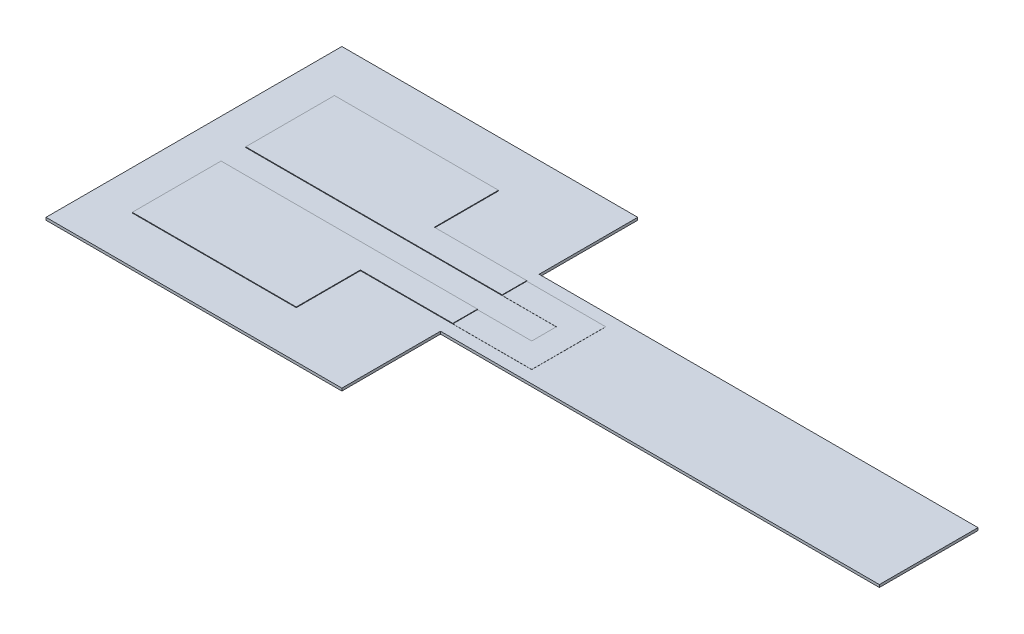
ISO-10303-21;
HEADER;
FILE_DESCRIPTION(('STEP AP214'),'2;1');
FILE_NAME('part.step','',(''),(''),'','','');
FILE_SCHEMA(('AUTOMOTIVE_DESIGN { 1 0 10303 214 1 1 1 1 }'));
ENDSEC;
DATA;
#1=APPLICATION_CONTEXT('core data for automotive mechanical design processes');
#2=APPLICATION_PROTOCOL_DEFINITION('international standard','automotive_design',2000,#1);
#3=PRODUCT_CONTEXT('',#1,'mechanical');
#4=PRODUCT('Part','Part','',(#3));
#5=PRODUCT_RELATED_PRODUCT_CATEGORY('part','',(#4));
#6=PRODUCT_DEFINITION_FORMATION('','',#4);
#7=PRODUCT_DEFINITION_CONTEXT('part definition',#1,'design');
#8=PRODUCT_DEFINITION('design','',#6,#7);
#9=PRODUCT_DEFINITION_SHAPE('','',#8);
#10=(LENGTH_UNIT() NAMED_UNIT(*) SI_UNIT(.MILLI.,.METRE.));
#11=(NAMED_UNIT(*) PLANE_ANGLE_UNIT() SI_UNIT($,.RADIAN.));
#12=(NAMED_UNIT(*) SI_UNIT($,.STERADIAN.) SOLID_ANGLE_UNIT());
#13=UNCERTAINTY_MEASURE_WITH_UNIT(LENGTH_MEASURE(1.E-05),#10,'distance_accuracy_value','');
#14=(GEOMETRIC_REPRESENTATION_CONTEXT(3) GLOBAL_UNCERTAINTY_ASSIGNED_CONTEXT((#13)) GLOBAL_UNIT_ASSIGNED_CONTEXT((#10,
#11,#12)) REPRESENTATION_CONTEXT('',''));
#15=CARTESIAN_POINT('',(0.,0.,0.));
#16=DIRECTION('',(0.,0.,1.));
#17=DIRECTION('',(1.,0.,0.));
#18=AXIS2_PLACEMENT_3D('',#15,#16,#17);
#19=CARTESIAN_POINT('',(0.,0.0001,0.));
#20=DIRECTION('',(0.,1.,0.));
#21=DIRECTION('',(0.,0.,1.));
#22=AXIS2_PLACEMENT_3D('',#19,#20,#21);
#23=PLANE('',#22);
#24=DIRECTION('',(0.,0.,1.));
#25=VECTOR('',#24,1.);
#26=CARTESIAN_POINT('',(0.,0.0001,-15.));
#27=LINE('',#26,#25);
#28=CARTESIAN_POINT('',(0.,0.0001,-15.));
#29=VERTEX_POINT('',#28);
#30=CARTESIAN_POINT('',(0.,0.0001,15.));
#31=VERTEX_POINT('',#30);
#32=EDGE_CURVE('E329',#29,#31,#27,.T.);
#33=ORIENTED_EDGE('',*,*,#32,.T.);
#34=DIRECTION('',(1.,0.,0.));
#35=VECTOR('',#34,1.);
#36=CARTESIAN_POINT('',(0.,0.0001,15.));
#37=LINE('',#36,#35);
#38=CARTESIAN_POINT('',(30.,0.0001,15.));
#39=VERTEX_POINT('',#38);
#40=EDGE_CURVE('E332',#31,#39,#37,.T.);
#41=ORIENTED_EDGE('',*,*,#40,.T.);
#42=DIRECTION('',(0.,0.,-1.));
#43=VECTOR('',#42,1.);
#44=CARTESIAN_POINT('',(30.,0.0001,15.));
#45=LINE('',#44,#43);
#46=CARTESIAN_POINT('',(30.,0.0001,5.));
#47=VERTEX_POINT('',#46);
#48=EDGE_CURVE('E334',#39,#47,#45,.T.);
#49=ORIENTED_EDGE('',*,*,#48,.T.);
#50=DIRECTION('',(1.,0.,0.));
#51=VECTOR('',#50,1.);
#52=CARTESIAN_POINT('',(30.,0.0001,5.));
#53=LINE('',#52,#51);
#54=CARTESIAN_POINT('',(74.5,0.0001,5.));
#55=VERTEX_POINT('',#54);
#56=EDGE_CURVE('E336',#47,#55,#53,.T.);
#57=ORIENTED_EDGE('',*,*,#56,.T.);
#58=DIRECTION('',(0.,0.,-1.));
#59=VECTOR('',#58,1.);
#60=CARTESIAN_POINT('',(74.5,0.0001,-5.));
#61=LINE('',#60,#59);
#62=CARTESIAN_POINT('',(74.5,0.0001,-5.));
#63=VERTEX_POINT('',#62);
#64=EDGE_CURVE('E338',#55,#63,#61,.T.);
#65=ORIENTED_EDGE('',*,*,#64,.T.);
#66=DIRECTION('',(-1.,0.,0.));
#67=VECTOR('',#66,1.);
#68=CARTESIAN_POINT('',(30.,0.0001,-5.));
#69=LINE('',#68,#67);
#70=CARTESIAN_POINT('',(30.,0.0001,-5.));
#71=VERTEX_POINT('',#70);
#72=EDGE_CURVE('E340',#63,#71,#69,.T.);
#73=ORIENTED_EDGE('',*,*,#72,.T.);
#74=DIRECTION('',(0.,0.,-1.));
#75=VECTOR('',#74,1.);
#76=CARTESIAN_POINT('',(30.,0.0001,-15.));
#77=LINE('',#76,#75);
#78=CARTESIAN_POINT('',(30.,0.0001,-15.));
#79=VERTEX_POINT('',#78);
#80=EDGE_CURVE('E342',#71,#79,#77,.T.);
#81=ORIENTED_EDGE('',*,*,#80,.T.);
#82=DIRECTION('',(-1.,0.,0.));
#83=VECTOR('',#82,1.);
#84=CARTESIAN_POINT('',(0.,0.0001,-15.));
#85=LINE('',#84,#83);
#86=EDGE_CURVE('E344',#79,#29,#85,.T.);
#87=ORIENTED_EDGE('',*,*,#86,.T.);
#88=EDGE_LOOP('',(#33,#41,#49,#57,#65,#73,#81,#87));
#89=FACE_BOUND('',#88,.T.);
#90=DIRECTION('',(0.,0.,1.));
#91=VECTOR('',#90,1.);
#92=CARTESIAN_POINT('',(4.,0.0001,10.25));
#93=LINE('',#92,#91);
#94=CARTESIAN_POINT('',(4.,0.0001,1.25000000000001));
#95=VERTEX_POINT('',#94);
#96=CARTESIAN_POINT('',(4.,0.0001,10.25));
#97=VERTEX_POINT('',#96);
#98=EDGE_CURVE('E401',#95,#97,#93,.T.);
#99=ORIENTED_EDGE('',*,*,#98,.F.);
#100=DIRECTION('',(-1.,0.,0.));
#101=VECTOR('',#100,1.);
#102=CARTESIAN_POINT('',(35.5,0.0001,1.25));
#103=LINE('',#102,#101);
#104=CARTESIAN_POINT('',(35.5,0.0001,1.25));
#105=VERTEX_POINT('',#104);
#106=EDGE_CURVE('E60',#105,#95,#103,.T.);
#107=ORIENTED_EDGE('',*,*,#106,.F.);
#108=DIRECTION('',(0.,0.,1.));
#109=VECTOR('',#108,1.);
#110=CARTESIAN_POINT('',(35.5,0.0001,-1.24999999999999));
#111=LINE('',#110,#109);
#112=CARTESIAN_POINT('',(35.5,0.0001,-1.24999999999999));
#113=VERTEX_POINT('',#112);
#114=EDGE_CURVE('E290',#113,#105,#111,.T.);
#115=ORIENTED_EDGE('',*,*,#114,.F.);
#116=DIRECTION('',(1.,0.,0.));
#117=VECTOR('',#116,1.);
#118=CARTESIAN_POINT('',(30.,0.0001,-1.24999999999999));
#119=LINE('',#118,#117);
#120=CARTESIAN_POINT('',(4.,0.0001,-1.24999999999999));
#121=VERTEX_POINT('',#120);
#122=EDGE_CURVE('E287',#121,#113,#119,.T.);
#123=ORIENTED_EDGE('',*,*,#122,.F.);
#124=DIRECTION('',(0.,0.,1.));
#125=VECTOR('',#124,1.);
#126=CARTESIAN_POINT('',(4.,0.0001,-10.25));
#127=LINE('',#126,#125);
#128=CARTESIAN_POINT('',(4.,0.0001,-10.25));
#129=VERTEX_POINT('',#128);
#130=EDGE_CURVE('E234',#129,#121,#127,.T.);
#131=ORIENTED_EDGE('',*,*,#130,.F.);
#132=DIRECTION('',(-1.,0.,0.));
#133=VECTOR('',#132,1.);
#134=CARTESIAN_POINT('',(4.,0.0001,-10.25));
#135=LINE('',#134,#133);
#136=CARTESIAN_POINT('',(20.6275890528931,0.0001,-10.25));
#137=VERTEX_POINT('',#136);
#138=EDGE_CURVE('E224',#137,#129,#135,.T.);
#139=ORIENTED_EDGE('',*,*,#138,.F.);
#140=DIRECTION('',(0.,0.,-1.));
#141=VECTOR('',#140,1.);
#142=CARTESIAN_POINT('',(20.6275890528931,0.0001,-10.25));
#143=LINE('',#142,#141);
#144=CARTESIAN_POINT('',(20.6275890528931,0.0001,-3.74999999999999));
#145=VERTEX_POINT('',#144);
#146=EDGE_CURVE('E222',#145,#137,#143,.T.);
#147=ORIENTED_EDGE('',*,*,#146,.F.);
#148=DIRECTION('',(-1.,0.,0.));
#149=VECTOR('',#148,1.);
#150=CARTESIAN_POINT('',(38.,0.0001,-3.75));
#151=LINE('',#150,#149);
#152=CARTESIAN_POINT('',(38.,0.0001,-3.75));
#153=VERTEX_POINT('',#152);
#154=EDGE_CURVE('E285',#153,#145,#151,.T.);
#155=ORIENTED_EDGE('',*,*,#154,.F.);
#156=DIRECTION('',(0.,0.,-1.));
#157=VECTOR('',#156,1.);
#158=CARTESIAN_POINT('',(38.,0.0001,3.75));
#159=LINE('',#158,#157);
#160=CARTESIAN_POINT('',(38.,0.0001,3.75));
#161=VERTEX_POINT('',#160);
#162=EDGE_CURVE('E53',#161,#153,#159,.T.);
#163=ORIENTED_EDGE('',*,*,#162,.F.);
#164=DIRECTION('',(1.,0.,0.));
#165=VECTOR('',#164,1.);
#166=CARTESIAN_POINT('',(30.,0.0001,3.75));
#167=LINE('',#166,#165);
#168=CARTESIAN_POINT('',(20.6275890528931,0.0001,3.75));
#169=VERTEX_POINT('',#168);
#170=EDGE_CURVE('E268',#169,#161,#167,.T.);
#171=ORIENTED_EDGE('',*,*,#170,.F.);
#172=DIRECTION('',(0.,0.,-1.));
#173=VECTOR('',#172,1.);
#174=CARTESIAN_POINT('',(20.6275890528931,0.0001,3.75));
#175=LINE('',#174,#173);
#176=CARTESIAN_POINT('',(20.6275890528931,0.0001,10.25));
#177=VERTEX_POINT('',#176);
#178=EDGE_CURVE('E217',#177,#169,#175,.T.);
#179=ORIENTED_EDGE('',*,*,#178,.F.);
#180=DIRECTION('',(1.,0.,0.));
#181=VECTOR('',#180,1.);
#182=CARTESIAN_POINT('',(20.6275890528931,0.0001,10.25));
#183=LINE('',#182,#181);
#184=EDGE_CURVE('E403',#97,#177,#183,.T.);
#185=ORIENTED_EDGE('',*,*,#184,.F.);
#186=EDGE_LOOP('',(#99,#107,#115,#123,#131,#139,#147,#155,#163,#171,#179,#185));
#187=FACE_BOUND('',#186,.T.);
#188=ADVANCED_FACE('F38',(#89,#187),#23,.T.);
#189=CARTESIAN_POINT('',(0.,0.0001,-15.));
#190=DIRECTION('',(1.,0.,0.));
#191=DIRECTION('',(0.,0.,-1.));
#192=AXIS2_PLACEMENT_3D('',#189,#190,#191);
#193=PLANE('',#192);
#194=DIRECTION('',(0.,-1.,0.));
#195=VECTOR('',#194,1.);
#196=CARTESIAN_POINT('',(0.,0.0001,-15.));
#197=LINE('',#196,#195);
#198=CARTESIAN_POINT('',(0.,-0.26,-15.));
#199=VERTEX_POINT('',#198);
#200=EDGE_CURVE('E346',#29,#199,#197,.T.);
#201=ORIENTED_EDGE('',*,*,#200,.T.);
#202=DIRECTION('',(0.,0.,1.));
#203=VECTOR('',#202,1.);
#204=CARTESIAN_POINT('',(0.,-0.26,-15.));
#205=LINE('',#204,#203);
#206=CARTESIAN_POINT('',(0.,-0.26,15.));
#207=VERTEX_POINT('',#206);
#208=EDGE_CURVE('E305',#199,#207,#205,.T.);
#209=ORIENTED_EDGE('',*,*,#208,.T.);
#210=DIRECTION('',(0.,-1.,0.));
#211=VECTOR('',#210,1.);
#212=CARTESIAN_POINT('',(0.,0.0001,15.));
#213=LINE('',#212,#211);
#214=EDGE_CURVE('E11',#31,#207,#213,.T.);
#215=ORIENTED_EDGE('',*,*,#214,.F.);
#216=ORIENTED_EDGE('',*,*,#32,.F.);
#217=EDGE_LOOP('',(#201,#209,#215,#216));
#218=FACE_BOUND('',#217,.T.);
#219=ADVANCED_FACE('F40',(#218),#193,.F.);
#220=CARTESIAN_POINT('',(0.,0.0001,15.));
#221=DIRECTION('',(0.,0.,-1.));
#222=DIRECTION('',(-1.,0.,0.));
#223=AXIS2_PLACEMENT_3D('',#220,#221,#222);
#224=PLANE('',#223);
#225=ORIENTED_EDGE('',*,*,#214,.T.);
#226=DIRECTION('',(1.,0.,0.));
#227=VECTOR('',#226,1.);
#228=CARTESIAN_POINT('',(0.,-0.26,15.));
#229=LINE('',#228,#227);
#230=CARTESIAN_POINT('',(30.,-0.26,15.));
#231=VERTEX_POINT('',#230);
#232=EDGE_CURVE('E308',#207,#231,#229,.T.);
#233=ORIENTED_EDGE('',*,*,#232,.T.);
#234=DIRECTION('',(0.,-1.,0.));
#235=VECTOR('',#234,1.);
#236=CARTESIAN_POINT('',(30.,0.0001,15.));
#237=LINE('',#236,#235);
#238=EDGE_CURVE('E46',#39,#231,#237,.T.);
#239=ORIENTED_EDGE('',*,*,#238,.F.);
#240=ORIENTED_EDGE('',*,*,#40,.F.);
#241=EDGE_LOOP('',(#225,#233,#239,#240));
#242=FACE_BOUND('',#241,.T.);
#243=ADVANCED_FACE('F370',(#242),#224,.F.);
#244=CARTESIAN_POINT('',(30.,0.0001,15.));
#245=DIRECTION('',(-1.,0.,0.));
#246=DIRECTION('',(0.,0.,1.));
#247=AXIS2_PLACEMENT_3D('',#244,#245,#246);
#248=PLANE('',#247);
#249=ORIENTED_EDGE('',*,*,#238,.T.);
#250=DIRECTION('',(0.,0.,-1.));
#251=VECTOR('',#250,1.);
#252=CARTESIAN_POINT('',(30.,-0.26,15.));
#253=LINE('',#252,#251);
#254=CARTESIAN_POINT('',(30.,-0.26,5.));
#255=VERTEX_POINT('',#254);
#256=EDGE_CURVE('E311',#231,#255,#253,.T.);
#257=ORIENTED_EDGE('',*,*,#256,.T.);
#258=DIRECTION('',(0.,-1.,0.));
#259=VECTOR('',#258,1.);
#260=CARTESIAN_POINT('',(30.,0.0001,5.));
#261=LINE('',#260,#259);
#262=EDGE_CURVE('E356',#47,#255,#261,.T.);
#263=ORIENTED_EDGE('',*,*,#262,.F.);
#264=ORIENTED_EDGE('',*,*,#48,.F.);
#265=EDGE_LOOP('',(#249,#257,#263,#264));
#266=FACE_BOUND('',#265,.T.);
#267=ADVANCED_FACE('F361',(#266),#248,.F.);
#268=CARTESIAN_POINT('',(30.,0.0001,5.));
#269=DIRECTION('',(0.,0.,-1.));
#270=DIRECTION('',(-1.,0.,0.));
#271=AXIS2_PLACEMENT_3D('',#268,#269,#270);
#272=PLANE('',#271);
#273=ORIENTED_EDGE('',*,*,#262,.T.);
#274=DIRECTION('',(1.,0.,0.));
#275=VECTOR('',#274,1.);
#276=CARTESIAN_POINT('',(30.,-0.26,5.));
#277=LINE('',#276,#275);
#278=CARTESIAN_POINT('',(74.5,-0.26,5.));
#279=VERTEX_POINT('',#278);
#280=EDGE_CURVE('E314',#255,#279,#277,.T.);
#281=ORIENTED_EDGE('',*,*,#280,.T.);
#282=DIRECTION('',(0.,-1.,0.));
#283=VECTOR('',#282,1.);
#284=CARTESIAN_POINT('',(74.5,0.0001,5.));
#285=LINE('',#284,#283);
#286=EDGE_CURVE('E354',#55,#279,#285,.T.);
#287=ORIENTED_EDGE('',*,*,#286,.F.);
#288=ORIENTED_EDGE('',*,*,#56,.F.);
#289=EDGE_LOOP('',(#273,#281,#287,#288));
#290=FACE_BOUND('',#289,.T.);
#291=ADVANCED_FACE('F395',(#290),#272,.F.);
#292=CARTESIAN_POINT('',(74.5,0.0001,-5.));
#293=DIRECTION('',(-1.,0.,0.));
#294=DIRECTION('',(0.,0.,1.));
#295=AXIS2_PLACEMENT_3D('',#292,#293,#294);
#296=PLANE('',#295);
#297=ORIENTED_EDGE('',*,*,#286,.T.);
#298=DIRECTION('',(0.,0.,-1.));
#299=VECTOR('',#298,1.);
#300=CARTESIAN_POINT('',(74.5,-0.26,-5.));
#301=LINE('',#300,#299);
#302=CARTESIAN_POINT('',(74.5,-0.26,-5.));
#303=VERTEX_POINT('',#302);
#304=EDGE_CURVE('E317',#279,#303,#301,.T.);
#305=ORIENTED_EDGE('',*,*,#304,.T.);
#306=DIRECTION('',(0.,-1.,0.));
#307=VECTOR('',#306,1.);
#308=CARTESIAN_POINT('',(74.5,0.0001,-5.));
#309=LINE('',#308,#307);
#310=EDGE_CURVE('E352',#63,#303,#309,.T.);
#311=ORIENTED_EDGE('',*,*,#310,.F.);
#312=ORIENTED_EDGE('',*,*,#64,.F.);
#313=EDGE_LOOP('',(#297,#305,#311,#312));
#314=FACE_BOUND('',#313,.T.);
#315=ADVANCED_FACE('F392',(#314),#296,.F.);
#316=CARTESIAN_POINT('',(30.,0.0001,-5.));
#317=DIRECTION('',(0.,0.,1.));
#318=DIRECTION('',(1.,0.,0.));
#319=AXIS2_PLACEMENT_3D('',#316,#317,#318);
#320=PLANE('',#319);
#321=ORIENTED_EDGE('',*,*,#310,.T.);
#322=DIRECTION('',(-1.,0.,0.));
#323=VECTOR('',#322,1.);
#324=CARTESIAN_POINT('',(30.,-0.26,-5.));
#325=LINE('',#324,#323);
#326=CARTESIAN_POINT('',(30.,-0.26,-5.));
#327=VERTEX_POINT('',#326);
#328=EDGE_CURVE('E320',#303,#327,#325,.T.);
#329=ORIENTED_EDGE('',*,*,#328,.T.);
#330=DIRECTION('',(0.,-1.,0.));
#331=VECTOR('',#330,1.);
#332=CARTESIAN_POINT('',(30.,0.0001,-5.));
#333=LINE('',#332,#331);
#334=EDGE_CURVE('E350',#71,#327,#333,.T.);
#335=ORIENTED_EDGE('',*,*,#334,.F.);
#336=ORIENTED_EDGE('',*,*,#72,.F.);
#337=EDGE_LOOP('',(#321,#329,#335,#336));
#338=FACE_BOUND('',#337,.T.);
#339=ADVANCED_FACE('F387',(#338),#320,.F.);
#340=CARTESIAN_POINT('',(30.,0.0001,-15.));
#341=DIRECTION('',(-1.,0.,0.));
#342=DIRECTION('',(0.,0.,1.));
#343=AXIS2_PLACEMENT_3D('',#340,#341,#342);
#344=PLANE('',#343);
#345=ORIENTED_EDGE('',*,*,#334,.T.);
#346=DIRECTION('',(0.,0.,-1.));
#347=VECTOR('',#346,1.);
#348=CARTESIAN_POINT('',(30.,-0.26,-15.));
#349=LINE('',#348,#347);
#350=CARTESIAN_POINT('',(30.,-0.26,-15.));
#351=VERTEX_POINT('',#350);
#352=EDGE_CURVE('E323',#327,#351,#349,.T.);
#353=ORIENTED_EDGE('',*,*,#352,.T.);
#354=DIRECTION('',(0.,-1.,0.));
#355=VECTOR('',#354,1.);
#356=CARTESIAN_POINT('',(30.,0.0001,-15.));
#357=LINE('',#356,#355);
#358=EDGE_CURVE('E348',#79,#351,#357,.T.);
#359=ORIENTED_EDGE('',*,*,#358,.F.);
#360=ORIENTED_EDGE('',*,*,#80,.F.);
#361=EDGE_LOOP('',(#345,#353,#359,#360));
#362=FACE_BOUND('',#361,.T.);
#363=ADVANCED_FACE('F383',(#362),#344,.F.);
#364=CARTESIAN_POINT('',(0.,0.0001,-15.));
#365=DIRECTION('',(0.,0.,1.));
#366=DIRECTION('',(1.,0.,0.));
#367=AXIS2_PLACEMENT_3D('',#364,#365,#366);
#368=PLANE('',#367);
#369=ORIENTED_EDGE('',*,*,#358,.T.);
#370=DIRECTION('',(-1.,0.,0.));
#371=VECTOR('',#370,1.);
#372=CARTESIAN_POINT('',(0.,-0.26,-15.));
#373=LINE('',#372,#371);
#374=EDGE_CURVE('E326',#351,#199,#373,.T.);
#375=ORIENTED_EDGE('',*,*,#374,.T.);
#376=ORIENTED_EDGE('',*,*,#200,.F.);
#377=ORIENTED_EDGE('',*,*,#86,.F.);
#378=EDGE_LOOP('',(#369,#375,#376,#377));
#379=FACE_BOUND('',#378,.T.);
#380=ADVANCED_FACE('F378',(#379),#368,.F.);
#381=CARTESIAN_POINT('',(0.,-0.26,0.));
#382=DIRECTION('',(0.,1.,0.));
#383=DIRECTION('',(0.,0.,1.));
#384=AXIS2_PLACEMENT_3D('',#381,#382,#383);
#385=PLANE('',#384);
#386=ORIENTED_EDGE('',*,*,#208,.F.);
#387=ORIENTED_EDGE('',*,*,#374,.F.);
#388=ORIENTED_EDGE('',*,*,#352,.F.);
#389=ORIENTED_EDGE('',*,*,#328,.F.);
#390=ORIENTED_EDGE('',*,*,#304,.F.);
#391=ORIENTED_EDGE('',*,*,#280,.F.);
#392=ORIENTED_EDGE('',*,*,#256,.F.);
#393=ORIENTED_EDGE('',*,*,#232,.F.);
#394=EDGE_LOOP('',(#386,#387,#388,#389,#390,#391,#392,#393));
#395=FACE_BOUND('',#394,.T.);
#396=ADVANCED_FACE('F368',(#395),#385,.F.);
#397=CARTESIAN_POINT('',(38.,0.0127,3.75));
#398=DIRECTION('',(-1.,0.,0.));
#399=DIRECTION('',(0.,0.,1.));
#400=AXIS2_PLACEMENT_3D('',#397,#398,#399);
#401=PLANE('',#400);
#402=ORIENTED_EDGE('',*,*,#162,.T.);
#403=DIRECTION('',(0.,-1.,0.));
#404=VECTOR('',#403,1.);
#405=CARTESIAN_POINT('',(38.,0.0127,-3.75));
#406=LINE('',#405,#404);
#407=CARTESIAN_POINT('',(38.,0.0127,-3.75));
#408=VERTEX_POINT('',#407);
#409=EDGE_CURVE('E302',#408,#153,#406,.T.);
#410=ORIENTED_EDGE('',*,*,#409,.F.);
#411=DIRECTION('',(0.,0.,-1.));
#412=VECTOR('',#411,1.);
#413=CARTESIAN_POINT('',(38.,0.0127,3.75));
#414=LINE('',#413,#412);
#415=CARTESIAN_POINT('',(38.,0.0127,3.75));
#416=VERTEX_POINT('',#415);
#417=EDGE_CURVE('E264',#416,#408,#414,.T.);
#418=ORIENTED_EDGE('',*,*,#417,.F.);
#419=DIRECTION('',(0.,-1.,0.));
#420=VECTOR('',#419,1.);
#421=CARTESIAN_POINT('',(38.,0.0127,3.75));
#422=LINE('',#421,#420);
#423=EDGE_CURVE('E283',#416,#161,#422,.T.);
#424=ORIENTED_EDGE('',*,*,#423,.T.);
#425=EDGE_LOOP('',(#402,#410,#418,#424));
#426=FACE_BOUND('',#425,.T.);
#427=ADVANCED_FACE('F471',(#426),#401,.F.);
#428=CARTESIAN_POINT('',(38.,0.0127,-3.75));
#429=DIRECTION('',(0.,0.,1.));
#430=DIRECTION('',(1.,0.,0.));
#431=AXIS2_PLACEMENT_3D('',#428,#429,#430);
#432=PLANE('',#431);
#433=ORIENTED_EDGE('',*,*,#154,.T.);
#434=DIRECTION('',(0.,-1.,0.));
#435=VECTOR('',#434,1.);
#436=CARTESIAN_POINT('',(20.6275890528931,0.0667,-3.74999999999999));
#437=LINE('',#436,#435);
#438=CARTESIAN_POINT('',(20.6275890528931,0.0667,-3.74999999999999));
#439=VERTEX_POINT('',#438);
#440=EDGE_CURVE('E258',#439,#145,#437,.T.);
#441=ORIENTED_EDGE('',*,*,#440,.F.);
#442=DIRECTION('',(-1.,0.,0.));
#443=VECTOR('',#442,1.);
#444=CARTESIAN_POINT('',(30.,0.0667,-3.74999999999999));
#445=LINE('',#444,#443);
#446=CARTESIAN_POINT('',(30.,0.0667,-3.74999999999999));
#447=VERTEX_POINT('',#446);
#448=EDGE_CURVE('E233',#447,#439,#445,.T.);
#449=ORIENTED_EDGE('',*,*,#448,.F.);
#450=DIRECTION('',(0.,-1.,0.));
#451=VECTOR('',#450,1.);
#452=CARTESIAN_POINT('',(30.,0.0667,-3.74999999999999));
#453=LINE('',#452,#451);
#454=CARTESIAN_POINT('',(30.,0.0127,-3.74999999999999));
#455=VERTEX_POINT('',#454);
#456=EDGE_CURVE('E261',#447,#455,#453,.T.);
#457=ORIENTED_EDGE('',*,*,#456,.T.);
#458=DIRECTION('',(-1.,0.,0.));
#459=VECTOR('',#458,1.);
#460=CARTESIAN_POINT('',(38.,0.0127,-3.75));
#461=LINE('',#460,#459);
#462=EDGE_CURVE('E267',#408,#455,#461,.T.);
#463=ORIENTED_EDGE('',*,*,#462,.F.);
#464=ORIENTED_EDGE('',*,*,#409,.T.);
#465=EDGE_LOOP('',(#433,#441,#449,#457,#463,#464));
#466=FACE_BOUND('',#465,.T.);
#467=ADVANCED_FACE('F467',(#466),#432,.F.);
#468=CARTESIAN_POINT('',(30.,0.0127,-1.24999999999999));
#469=DIRECTION('',(0.,0.,-1.));
#470=DIRECTION('',(-1.,0.,0.));
#471=AXIS2_PLACEMENT_3D('',#468,#469,#470);
#472=PLANE('',#471);
#473=ORIENTED_EDGE('',*,*,#122,.T.);
#474=DIRECTION('',(0.,-1.,0.));
#475=VECTOR('',#474,1.);
#476=CARTESIAN_POINT('',(35.5,0.0127,-1.24999999999999));
#477=LINE('',#476,#475);
#478=CARTESIAN_POINT('',(35.5,0.0127,-1.24999999999999));
#479=VERTEX_POINT('',#478);
#480=EDGE_CURVE('E299',#479,#113,#477,.T.);
#481=ORIENTED_EDGE('',*,*,#480,.F.);
#482=DIRECTION('',(1.,0.,0.));
#483=VECTOR('',#482,1.);
#484=CARTESIAN_POINT('',(30.,0.0127,-1.24999999999999));
#485=LINE('',#484,#483);
#486=CARTESIAN_POINT('',(30.,0.0127,-1.24999999999999));
#487=VERTEX_POINT('',#486);
#488=EDGE_CURVE('E274',#487,#479,#485,.T.);
#489=ORIENTED_EDGE('',*,*,#488,.F.);
#490=DIRECTION('',(0.,-1.,0.));
#491=VECTOR('',#490,1.);
#492=CARTESIAN_POINT('',(30.,0.0667,-1.24999999999999));
#493=LINE('',#492,#491);
#494=CARTESIAN_POINT('',(30.,0.0667,-1.24999999999999));
#495=VERTEX_POINT('',#494);
#496=EDGE_CURVE('E243',#495,#487,#493,.T.);
#497=ORIENTED_EDGE('',*,*,#496,.F.);
#498=DIRECTION('',(1.,0.,0.));
#499=VECTOR('',#498,1.);
#500=CARTESIAN_POINT('',(30.,0.0667,-1.24999999999999));
#501=LINE('',#500,#499);
#502=CARTESIAN_POINT('',(4.,0.0667,-1.24999999999999));
#503=VERTEX_POINT('',#502);
#504=EDGE_CURVE('E242',#503,#495,#501,.T.);
#505=ORIENTED_EDGE('',*,*,#504,.F.);
#506=DIRECTION('',(0.,-1.,0.));
#507=VECTOR('',#506,1.);
#508=CARTESIAN_POINT('',(4.,0.0667,-1.24999999999999));
#509=LINE('',#508,#507);
#510=EDGE_CURVE('E249',#503,#121,#509,.T.);
#511=ORIENTED_EDGE('',*,*,#510,.T.);
#512=EDGE_LOOP('',(#473,#481,#489,#497,#505,#511));
#513=FACE_BOUND('',#512,.T.);
#514=ADVANCED_FACE('F447',(#513),#472,.F.);
#515=CARTESIAN_POINT('',(35.5,0.0127,-1.24999999999999));
#516=DIRECTION('',(1.,0.,0.));
#517=DIRECTION('',(0.,0.,-1.));
#518=AXIS2_PLACEMENT_3D('',#515,#516,#517);
#519=PLANE('',#518);
#520=ORIENTED_EDGE('',*,*,#114,.T.);
#521=DIRECTION('',(0.,-1.,0.));
#522=VECTOR('',#521,1.);
#523=CARTESIAN_POINT('',(35.5,0.0127,1.25));
#524=LINE('',#523,#522);
#525=CARTESIAN_POINT('',(35.5,0.0127,1.25));
#526=VERTEX_POINT('',#525);
#527=EDGE_CURVE('E296',#526,#105,#524,.T.);
#528=ORIENTED_EDGE('',*,*,#527,.F.);
#529=DIRECTION('',(0.,0.,1.));
#530=VECTOR('',#529,1.);
#531=CARTESIAN_POINT('',(35.5,0.0127,-1.24999999999999));
#532=LINE('',#531,#530);
#533=EDGE_CURVE('E276',#479,#526,#532,.T.);
#534=ORIENTED_EDGE('',*,*,#533,.F.);
#535=ORIENTED_EDGE('',*,*,#480,.T.);
#536=EDGE_LOOP('',(#520,#528,#534,#535));
#537=FACE_BOUND('',#536,.T.);
#538=ADVANCED_FACE('F443',(#537),#519,.F.);
#539=CARTESIAN_POINT('',(35.5,0.0127,1.25));
#540=DIRECTION('',(0.,0.,1.));
#541=DIRECTION('',(1.,0.,0.));
#542=AXIS2_PLACEMENT_3D('',#539,#540,#541);
#543=PLANE('',#542);
#544=ORIENTED_EDGE('',*,*,#106,.T.);
#545=DIRECTION('',(0.,-1.,0.));
#546=VECTOR('',#545,1.);
#547=CARTESIAN_POINT('',(4.,0.0667,1.25000000000001));
#548=LINE('',#547,#546);
#549=CARTESIAN_POINT('',(4.,0.0667,1.25000000000001));
#550=VERTEX_POINT('',#549);
#551=EDGE_CURVE('E205',#550,#95,#548,.T.);
#552=ORIENTED_EDGE('',*,*,#551,.F.);
#553=DIRECTION('',(-1.,0.,0.));
#554=VECTOR('',#553,1.);
#555=CARTESIAN_POINT('',(30.,0.0667,1.25));
#556=LINE('',#555,#554);
#557=CARTESIAN_POINT('',(30.,0.0667,1.25));
#558=VERTEX_POINT('',#557);
#559=EDGE_CURVE('E197',#558,#550,#556,.T.);
#560=ORIENTED_EDGE('',*,*,#559,.F.);
#561=DIRECTION('',(0.,-1.,0.));
#562=VECTOR('',#561,1.);
#563=CARTESIAN_POINT('',(30.,0.0667,1.25));
#564=LINE('',#563,#562);
#565=CARTESIAN_POINT('',(30.,0.0127,1.25));
#566=VERTEX_POINT('',#565);
#567=EDGE_CURVE('E202',#558,#566,#564,.T.);
#568=ORIENTED_EDGE('',*,*,#567,.T.);
#569=DIRECTION('',(-1.,0.,0.));
#570=VECTOR('',#569,1.);
#571=CARTESIAN_POINT('',(35.5,0.0127,1.25));
#572=LINE('',#571,#570);
#573=EDGE_CURVE('E278',#526,#566,#572,.T.);
#574=ORIENTED_EDGE('',*,*,#573,.F.);
#575=ORIENTED_EDGE('',*,*,#527,.T.);
#576=EDGE_LOOP('',(#544,#552,#560,#568,#574,#575));
#577=FACE_BOUND('',#576,.T.);
#578=ADVANCED_FACE('F199',(#577),#543,.F.);
#579=CARTESIAN_POINT('',(30.,0.0127,3.75));
#580=DIRECTION('',(0.,0.,-1.));
#581=DIRECTION('',(-1.,0.,0.));
#582=AXIS2_PLACEMENT_3D('',#579,#580,#581);
#583=PLANE('',#582);
#584=ORIENTED_EDGE('',*,*,#170,.T.);
#585=ORIENTED_EDGE('',*,*,#423,.F.);
#586=DIRECTION('',(1.,0.,0.));
#587=VECTOR('',#586,1.);
#588=CARTESIAN_POINT('',(30.,0.0127,3.75));
#589=LINE('',#588,#587);
#590=CARTESIAN_POINT('',(30.,0.0127,3.75));
#591=VERTEX_POINT('',#590);
#592=EDGE_CURVE('E281',#591,#416,#589,.T.);
#593=ORIENTED_EDGE('',*,*,#592,.F.);
#594=DIRECTION('',(0.,-1.,0.));
#595=VECTOR('',#594,1.);
#596=CARTESIAN_POINT('',(30.,0.0667,3.75));
#597=LINE('',#596,#595);
#598=CARTESIAN_POINT('',(30.,0.0667,3.75));
#599=VERTEX_POINT('',#598);
#600=EDGE_CURVE('E414',#599,#591,#597,.T.);
#601=ORIENTED_EDGE('',*,*,#600,.F.);
#602=DIRECTION('',(1.,0.,0.));
#603=VECTOR('',#602,1.);
#604=CARTESIAN_POINT('',(30.,0.0667,3.75));
#605=LINE('',#604,#603);
#606=CARTESIAN_POINT('',(20.6275890528931,0.0667,3.75));
#607=VERTEX_POINT('',#606);
#608=EDGE_CURVE('E214',#607,#599,#605,.T.);
#609=ORIENTED_EDGE('',*,*,#608,.F.);
#610=DIRECTION('',(0.,-1.,0.));
#611=VECTOR('',#610,1.);
#612=CARTESIAN_POINT('',(20.6275890528931,0.0667,3.75));
#613=LINE('',#612,#611);
#614=EDGE_CURVE('E416',#607,#169,#613,.T.);
#615=ORIENTED_EDGE('',*,*,#614,.T.);
#616=EDGE_LOOP('',(#584,#585,#593,#601,#609,#615));
#617=FACE_BOUND('',#616,.T.);
#618=ADVANCED_FACE('F435',(#617),#583,.F.);
#619=CARTESIAN_POINT('',(0.,0.0127,0.));
#620=DIRECTION('',(0.,1.,0.));
#621=DIRECTION('',(0.,0.,1.));
#622=AXIS2_PLACEMENT_3D('',#619,#620,#621);
#623=PLANE('',#622);
#624=ORIENTED_EDGE('',*,*,#417,.T.);
#625=ORIENTED_EDGE('',*,*,#462,.T.);
#626=DIRECTION('',(0.,0.,1.));
#627=VECTOR('',#626,1.);
#628=CARTESIAN_POINT('',(30.,0.0127,-3.74999999999999));
#629=LINE('',#628,#627);
#630=EDGE_CURVE('E271',#455,#487,#629,.T.);
#631=ORIENTED_EDGE('',*,*,#630,.T.);
#632=ORIENTED_EDGE('',*,*,#488,.T.);
#633=ORIENTED_EDGE('',*,*,#533,.T.);
#634=ORIENTED_EDGE('',*,*,#573,.T.);
#635=DIRECTION('',(0.,0.,1.));
#636=VECTOR('',#635,1.);
#637=CARTESIAN_POINT('',(30.,0.0127,1.25));
#638=LINE('',#637,#636);
#639=EDGE_CURVE('E221',#566,#591,#638,.T.);
#640=ORIENTED_EDGE('',*,*,#639,.T.);
#641=ORIENTED_EDGE('',*,*,#592,.T.);
#642=EDGE_LOOP('',(#624,#625,#631,#632,#633,#634,#640,#641));
#643=FACE_BOUND('',#642,.T.);
#644=ADVANCED_FACE('F439',(#643),#623,.T.);
#645=CARTESIAN_POINT('',(30.,0.0667,-3.74999999999999));
#646=DIRECTION('',(-1.,0.,0.));
#647=DIRECTION('',(0.,0.,1.));
#648=AXIS2_PLACEMENT_3D('',#645,#646,#647);
#649=PLANE('',#648);
#650=ORIENTED_EDGE('',*,*,#630,.F.);
#651=ORIENTED_EDGE('',*,*,#456,.F.);
#652=DIRECTION('',(0.,0.,-1.));
#653=VECTOR('',#652,1.);
#654=CARTESIAN_POINT('',(30.,0.0667,-3.74999999999999));
#655=LINE('',#654,#653);
#656=EDGE_CURVE('E230',#495,#447,#655,.T.);
#657=ORIENTED_EDGE('',*,*,#656,.F.);
#658=ORIENTED_EDGE('',*,*,#496,.T.);
#659=EDGE_LOOP('',(#650,#651,#657,#658));
#660=FACE_BOUND('',#659,.T.);
#661=ADVANCED_FACE('F475',(#660),#649,.F.);
#662=CARTESIAN_POINT('',(20.6275890528931,0.0667,-10.25));
#663=DIRECTION('',(-1.,0.,0.));
#664=DIRECTION('',(0.,0.,1.));
#665=AXIS2_PLACEMENT_3D('',#662,#663,#664);
#666=PLANE('',#665);
#667=ORIENTED_EDGE('',*,*,#146,.T.);
#668=DIRECTION('',(0.,-1.,0.));
#669=VECTOR('',#668,1.);
#670=CARTESIAN_POINT('',(20.6275890528931,0.0667,-10.25));
#671=LINE('',#670,#669);
#672=CARTESIAN_POINT('',(20.6275890528931,0.0667,-10.25));
#673=VERTEX_POINT('',#672);
#674=EDGE_CURVE('E255',#673,#137,#671,.T.);
#675=ORIENTED_EDGE('',*,*,#674,.F.);
#676=DIRECTION('',(0.,0.,-1.));
#677=VECTOR('',#676,1.);
#678=CARTESIAN_POINT('',(20.6275890528931,0.0667,-10.25));
#679=LINE('',#678,#677);
#680=EDGE_CURVE('E236',#439,#673,#679,.T.);
#681=ORIENTED_EDGE('',*,*,#680,.F.);
#682=ORIENTED_EDGE('',*,*,#440,.T.);
#683=EDGE_LOOP('',(#667,#675,#681,#682));
#684=FACE_BOUND('',#683,.T.);
#685=ADVANCED_FACE('F464',(#684),#666,.F.);
#686=CARTESIAN_POINT('',(4.,0.0667,-10.25));
#687=DIRECTION('',(0.,0.,1.));
#688=DIRECTION('',(1.,0.,0.));
#689=AXIS2_PLACEMENT_3D('',#686,#687,#688);
#690=PLANE('',#689);
#691=ORIENTED_EDGE('',*,*,#138,.T.);
#692=DIRECTION('',(0.,-1.,0.));
#693=VECTOR('',#692,1.);
#694=CARTESIAN_POINT('',(4.,0.0667,-10.25));
#695=LINE('',#694,#693);
#696=CARTESIAN_POINT('',(4.,0.0667,-10.25));
#697=VERTEX_POINT('',#696);
#698=EDGE_CURVE('E252',#697,#129,#695,.T.);
#699=ORIENTED_EDGE('',*,*,#698,.F.);
#700=DIRECTION('',(-1.,0.,0.));
#701=VECTOR('',#700,1.);
#702=CARTESIAN_POINT('',(4.,0.0667,-10.25));
#703=LINE('',#702,#701);
#704=EDGE_CURVE('E238',#673,#697,#703,.T.);
#705=ORIENTED_EDGE('',*,*,#704,.F.);
#706=ORIENTED_EDGE('',*,*,#674,.T.);
#707=EDGE_LOOP('',(#691,#699,#705,#706));
#708=FACE_BOUND('',#707,.T.);
#709=ADVANCED_FACE('F459',(#708),#690,.F.);
#710=CARTESIAN_POINT('',(4.,0.0667,-10.25));
#711=DIRECTION('',(1.,0.,0.));
#712=DIRECTION('',(0.,0.,-1.));
#713=AXIS2_PLACEMENT_3D('',#710,#711,#712);
#714=PLANE('',#713);
#715=ORIENTED_EDGE('',*,*,#130,.T.);
#716=ORIENTED_EDGE('',*,*,#510,.F.);
#717=DIRECTION('',(0.,0.,1.));
#718=VECTOR('',#717,1.);
#719=CARTESIAN_POINT('',(4.,0.0667,-10.25));
#720=LINE('',#719,#718);
#721=EDGE_CURVE('E240',#697,#503,#720,.T.);
#722=ORIENTED_EDGE('',*,*,#721,.F.);
#723=ORIENTED_EDGE('',*,*,#698,.T.);
#724=EDGE_LOOP('',(#715,#716,#722,#723));
#725=FACE_BOUND('',#724,.T.);
#726=ADVANCED_FACE('F454',(#725),#714,.F.);
#727=CARTESIAN_POINT('',(0.,0.0667,0.));
#728=DIRECTION('',(0.,-1.,0.));
#729=DIRECTION('',(0.,0.,-1.));
#730=AXIS2_PLACEMENT_3D('',#727,#728,#729);
#731=PLANE('',#730);
#732=ORIENTED_EDGE('',*,*,#656,.T.);
#733=ORIENTED_EDGE('',*,*,#448,.T.);
#734=ORIENTED_EDGE('',*,*,#680,.T.);
#735=ORIENTED_EDGE('',*,*,#704,.T.);
#736=ORIENTED_EDGE('',*,*,#721,.T.);
#737=ORIENTED_EDGE('',*,*,#504,.T.);
#738=EDGE_LOOP('',(#732,#733,#734,#735,#736,#737));
#739=FACE_BOUND('',#738,.T.);
#740=ADVANCED_FACE('F477',(#739),#731,.F.);
#741=CARTESIAN_POINT('',(30.,0.0667,1.25));
#742=DIRECTION('',(-1.,0.,0.));
#743=DIRECTION('',(0.,0.,1.));
#744=AXIS2_PLACEMENT_3D('',#741,#742,#743);
#745=PLANE('',#744);
#746=ORIENTED_EDGE('',*,*,#639,.F.);
#747=ORIENTED_EDGE('',*,*,#567,.F.);
#748=DIRECTION('',(0.,0.,-1.));
#749=VECTOR('',#748,1.);
#750=CARTESIAN_POINT('',(30.,0.0667,1.25));
#751=LINE('',#750,#749);
#752=EDGE_CURVE('E209',#599,#558,#751,.T.);
#753=ORIENTED_EDGE('',*,*,#752,.F.);
#754=ORIENTED_EDGE('',*,*,#600,.T.);
#755=EDGE_LOOP('',(#746,#747,#753,#754));
#756=FACE_BOUND('',#755,.T.);
#757=ADVANCED_FACE('F219',(#756),#745,.F.);
#758=CARTESIAN_POINT('',(4.,0.0667,10.25));
#759=DIRECTION('',(1.,0.,0.));
#760=DIRECTION('',(0.,0.,-1.));
#761=AXIS2_PLACEMENT_3D('',#758,#759,#760);
#762=PLANE('',#761);
#763=ORIENTED_EDGE('',*,*,#98,.T.);
#764=DIRECTION('',(0.,-1.,0.));
#765=VECTOR('',#764,1.);
#766=CARTESIAN_POINT('',(4.,0.0667,10.25));
#767=LINE('',#766,#765);
#768=CARTESIAN_POINT('',(4.,0.0667,10.25));
#769=VERTEX_POINT('',#768);
#770=EDGE_CURVE('E226',#769,#97,#767,.T.);
#771=ORIENTED_EDGE('',*,*,#770,.F.);
#772=DIRECTION('',(0.,0.,1.));
#773=VECTOR('',#772,1.);
#774=CARTESIAN_POINT('',(4.,0.0667,10.25));
#775=LINE('',#774,#773);
#776=EDGE_CURVE('E208',#550,#769,#775,.T.);
#777=ORIENTED_EDGE('',*,*,#776,.F.);
#778=ORIENTED_EDGE('',*,*,#551,.T.);
#779=EDGE_LOOP('',(#763,#771,#777,#778));
#780=FACE_BOUND('',#779,.T.);
#781=ADVANCED_FACE('F426',(#780),#762,.F.);
#782=CARTESIAN_POINT('',(20.6275890528931,0.0667,10.25));
#783=DIRECTION('',(0.,0.,-1.));
#784=DIRECTION('',(-1.,0.,0.));
#785=AXIS2_PLACEMENT_3D('',#782,#783,#784);
#786=PLANE('',#785);
#787=ORIENTED_EDGE('',*,*,#184,.T.);
#788=DIRECTION('',(0.,-1.,0.));
#789=VECTOR('',#788,1.);
#790=CARTESIAN_POINT('',(20.6275890528931,0.0667,10.25));
#791=LINE('',#790,#789);
#792=CARTESIAN_POINT('',(20.6275890528931,0.0667,10.25));
#793=VERTEX_POINT('',#792);
#794=EDGE_CURVE('E419',#793,#177,#791,.T.);
#795=ORIENTED_EDGE('',*,*,#794,.F.);
#796=DIRECTION('',(1.,0.,0.));
#797=VECTOR('',#796,1.);
#798=CARTESIAN_POINT('',(20.6275890528931,0.0667,10.25));
#799=LINE('',#798,#797);
#800=EDGE_CURVE('E425',#769,#793,#799,.T.);
#801=ORIENTED_EDGE('',*,*,#800,.F.);
#802=ORIENTED_EDGE('',*,*,#770,.T.);
#803=EDGE_LOOP('',(#787,#795,#801,#802));
#804=FACE_BOUND('',#803,.T.);
#805=ADVANCED_FACE('F423',(#804),#786,.F.);
#806=CARTESIAN_POINT('',(20.6275890528931,0.0667,3.75));
#807=DIRECTION('',(-1.,0.,0.));
#808=DIRECTION('',(0.,0.,1.));
#809=AXIS2_PLACEMENT_3D('',#806,#807,#808);
#810=PLANE('',#809);
#811=ORIENTED_EDGE('',*,*,#178,.T.);
#812=ORIENTED_EDGE('',*,*,#614,.F.);
#813=DIRECTION('',(0.,0.,-1.));
#814=VECTOR('',#813,1.);
#815=CARTESIAN_POINT('',(20.6275890528931,0.0667,3.75));
#816=LINE('',#815,#814);
#817=EDGE_CURVE('E428',#793,#607,#816,.T.);
#818=ORIENTED_EDGE('',*,*,#817,.F.);
#819=ORIENTED_EDGE('',*,*,#794,.T.);
#820=EDGE_LOOP('',(#811,#812,#818,#819));
#821=FACE_BOUND('',#820,.T.);
#822=ADVANCED_FACE('F433',(#821),#810,.F.);
#823=CARTESIAN_POINT('',(0.,0.0667,0.));
#824=DIRECTION('',(0.,-1.,0.));
#825=DIRECTION('',(0.,0.,-1.));
#826=AXIS2_PLACEMENT_3D('',#823,#824,#825);
#827=PLANE('',#826);
#828=ORIENTED_EDGE('',*,*,#752,.T.);
#829=ORIENTED_EDGE('',*,*,#559,.T.);
#830=ORIENTED_EDGE('',*,*,#776,.T.);
#831=ORIENTED_EDGE('',*,*,#800,.T.);
#832=ORIENTED_EDGE('',*,*,#817,.T.);
#833=ORIENTED_EDGE('',*,*,#608,.T.);
#834=EDGE_LOOP('',(#828,#829,#830,#831,#832,#833));
#835=FACE_BOUND('',#834,.T.);
#836=ADVANCED_FACE('F212',(#835),#827,.F.);
#837=CLOSED_SHELL('',(#188,#219,#243,#267,#291,#315,#339,#363,#380,#396,#427,#467,#514,#538,
#578,#618,#644,#661,#685,#709,#726,#740,#757,#781,#805,#822,#836));
#838=MANIFOLD_SOLID_BREP('B2',#837);
#839=ADVANCED_BREP_SHAPE_REPRESENTATION('',(#18,#838),#14);
#840=SHAPE_DEFINITION_REPRESENTATION(#9,#839);
ENDSEC;
END-ISO-10303-21;
